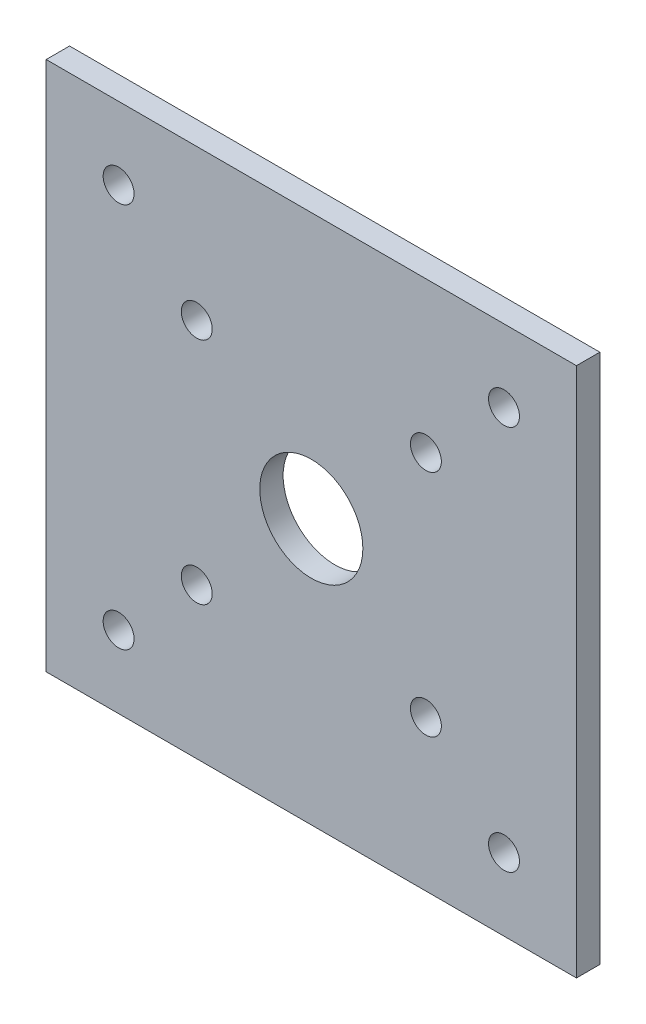
ISO-10303-21;
HEADER;
FILE_DESCRIPTION(('STEP AP214'),'2;1');
FILE_NAME('part.step','',(''),(''),'','','');
FILE_SCHEMA(('AUTOMOTIVE_DESIGN { 1 0 10303 214 1 1 1 1 }'));
ENDSEC;
DATA;
#1=APPLICATION_CONTEXT('core data for automotive mechanical design processes');
#2=APPLICATION_PROTOCOL_DEFINITION('international standard','automotive_design',2000,#1);
#3=PRODUCT_CONTEXT('',#1,'mechanical');
#4=PRODUCT('Part','Part','',(#3));
#5=PRODUCT_RELATED_PRODUCT_CATEGORY('part','',(#4));
#6=PRODUCT_DEFINITION_FORMATION('','',#4);
#7=PRODUCT_DEFINITION_CONTEXT('part definition',#1,'design');
#8=PRODUCT_DEFINITION('design','',#6,#7);
#9=PRODUCT_DEFINITION_SHAPE('','',#8);
#10=(LENGTH_UNIT() NAMED_UNIT(*) SI_UNIT(.MILLI.,.METRE.));
#11=(NAMED_UNIT(*) PLANE_ANGLE_UNIT() SI_UNIT($,.RADIAN.));
#12=(NAMED_UNIT(*) SI_UNIT($,.STERADIAN.) SOLID_ANGLE_UNIT());
#13=UNCERTAINTY_MEASURE_WITH_UNIT(LENGTH_MEASURE(1.E-05),#10,'distance_accuracy_value','');
#14=(GEOMETRIC_REPRESENTATION_CONTEXT(3) GLOBAL_UNCERTAINTY_ASSIGNED_CONTEXT((#13)) GLOBAL_UNIT_ASSIGNED_CONTEXT((#10,
#11,#12)) REPRESENTATION_CONTEXT('',''));
#15=CARTESIAN_POINT('',(0.,0.,0.));
#16=DIRECTION('',(0.,0.,1.));
#17=DIRECTION('',(1.,0.,0.));
#18=AXIS2_PLACEMENT_3D('',#15,#16,#17);
#19=CARTESIAN_POINT('',(0.,-36.,1.5875));
#20=DIRECTION('',(0.,1.,0.));
#21=DIRECTION('',(0.,0.,1.));
#22=AXIS2_PLACEMENT_3D('',#19,#20,#21);
#23=PLANE('',#22);
#24=DIRECTION('',(1.,0.,0.));
#25=VECTOR('',#24,1.);
#26=CARTESIAN_POINT('',(0.,-36.,-1.5875));
#27=LINE('',#26,#25);
#28=CARTESIAN_POINT('',(-36.,-36.,-1.5875));
#29=VERTEX_POINT('',#28);
#30=CARTESIAN_POINT('',(36.,-36.,-1.5875));
#31=VERTEX_POINT('',#30);
#32=EDGE_CURVE('E135',#29,#31,#27,.T.);
#33=ORIENTED_EDGE('',*,*,#32,.T.);
#34=DIRECTION('',(0.,0.,-1.));
#35=VECTOR('',#34,1.);
#36=CARTESIAN_POINT('',(36.,-36.,1.5875));
#37=LINE('',#36,#35);
#38=CARTESIAN_POINT('',(36.,-36.,1.5875));
#39=VERTEX_POINT('',#38);
#40=EDGE_CURVE('E11',#39,#31,#37,.T.);
#41=ORIENTED_EDGE('',*,*,#40,.F.);
#42=DIRECTION('',(1.,0.,0.));
#43=VECTOR('',#42,1.);
#44=CARTESIAN_POINT('',(0.,-36.,1.5875));
#45=LINE('',#44,#43);
#46=CARTESIAN_POINT('',(-36.,-36.,1.5875));
#47=VERTEX_POINT('',#46);
#48=EDGE_CURVE('E93',#47,#39,#45,.T.);
#49=ORIENTED_EDGE('',*,*,#48,.F.);
#50=DIRECTION('',(0.,0.,-1.));
#51=VECTOR('',#50,1.);
#52=CARTESIAN_POINT('',(-36.,-36.,1.5875));
#53=LINE('',#52,#51);
#54=EDGE_CURVE('E59',#47,#29,#53,.T.);
#55=ORIENTED_EDGE('',*,*,#54,.T.);
#56=EDGE_LOOP('',(#33,#41,#49,#55));
#57=FACE_BOUND('',#56,.T.);
#58=ADVANCED_FACE('F41',(#57),#23,.F.);
#59=CARTESIAN_POINT('',(36.,0.,1.5875));
#60=DIRECTION('',(-1.,0.,0.));
#61=DIRECTION('',(0.,0.,1.));
#62=AXIS2_PLACEMENT_3D('',#59,#60,#61);
#63=PLANE('',#62);
#64=DIRECTION('',(0.,1.,0.));
#65=VECTOR('',#64,1.);
#66=CARTESIAN_POINT('',(36.,0.,-1.5875));
#67=LINE('',#66,#65);
#68=CARTESIAN_POINT('',(36.,36.,-1.5875));
#69=VERTEX_POINT('',#68);
#70=EDGE_CURVE('E96',#31,#69,#67,.T.);
#71=ORIENTED_EDGE('',*,*,#70,.T.);
#72=DIRECTION('',(0.,0.,-1.));
#73=VECTOR('',#72,1.);
#74=CARTESIAN_POINT('',(36.,36.,1.5875));
#75=LINE('',#74,#73);
#76=CARTESIAN_POINT('',(36.,36.,1.5875));
#77=VERTEX_POINT('',#76);
#78=EDGE_CURVE('E49',#77,#69,#75,.T.);
#79=ORIENTED_EDGE('',*,*,#78,.F.);
#80=DIRECTION('',(0.,1.,0.));
#81=VECTOR('',#80,1.);
#82=CARTESIAN_POINT('',(36.,0.,1.5875));
#83=LINE('',#82,#81);
#84=EDGE_CURVE('E82',#39,#77,#83,.T.);
#85=ORIENTED_EDGE('',*,*,#84,.F.);
#86=ORIENTED_EDGE('',*,*,#40,.T.);
#87=EDGE_LOOP('',(#71,#79,#85,#86));
#88=FACE_BOUND('',#87,.T.);
#89=ADVANCED_FACE('F92',(#88),#63,.F.);
#90=CARTESIAN_POINT('',(0.,36.,1.5875));
#91=DIRECTION('',(0.,1.,0.));
#92=DIRECTION('',(0.,0.,1.));
#93=AXIS2_PLACEMENT_3D('',#90,#91,#92);
#94=PLANE('',#93);
#95=DIRECTION('',(1.,0.,0.));
#96=VECTOR('',#95,1.);
#97=CARTESIAN_POINT('',(0.,36.,-1.5875));
#98=LINE('',#97,#96);
#99=CARTESIAN_POINT('',(-36.,36.,-1.5875));
#100=VERTEX_POINT('',#99);
#101=EDGE_CURVE('E133',#100,#69,#98,.T.);
#102=ORIENTED_EDGE('',*,*,#101,.F.);
#103=DIRECTION('',(0.,0.,-1.));
#104=VECTOR('',#103,1.);
#105=CARTESIAN_POINT('',(-36.,36.,1.5875));
#106=LINE('',#105,#104);
#107=CARTESIAN_POINT('',(-36.,36.,1.5875));
#108=VERTEX_POINT('',#107);
#109=EDGE_CURVE('E75',#108,#100,#106,.T.);
#110=ORIENTED_EDGE('',*,*,#109,.F.);
#111=DIRECTION('',(1.,0.,0.));
#112=VECTOR('',#111,1.);
#113=CARTESIAN_POINT('',(0.,36.,1.5875));
#114=LINE('',#113,#112);
#115=EDGE_CURVE('E89',#108,#77,#114,.T.);
#116=ORIENTED_EDGE('',*,*,#115,.T.);
#117=ORIENTED_EDGE('',*,*,#78,.T.);
#118=EDGE_LOOP('',(#102,#110,#116,#117));
#119=FACE_BOUND('',#118,.T.);
#120=ADVANCED_FACE('F97',(#119),#94,.T.);
#121=CARTESIAN_POINT('',(-15.5563491861041,15.556349186104,1.5875));
#122=DIRECTION('',(0.,0.,-1.));
#123=DIRECTION('',(-1.,0.,0.));
#124=AXIS2_PLACEMENT_3D('',#121,#122,#123);
#125=CYLINDRICAL_SURFACE('',#124,2.10000000000001);
#126=CARTESIAN_POINT('',(-15.5563491861041,15.556349186104,1.5875));
#127=DIRECTION('',(0.,0.,1.));
#128=DIRECTION('',(1.,0.,0.));
#129=AXIS2_PLACEMENT_3D('',#126,#127,#128);
#130=CIRCLE('',#129,2.10000000000001);
#131=CARTESIAN_POINT('',(-13.4563491861041,15.556349186104,1.5875));
#132=VERTEX_POINT('',#131);
#133=EDGE_CURVE('E166',#132,#132,#130,.T.);
#134=ORIENTED_EDGE('',*,*,#133,.T.);
#135=EDGE_LOOP('',(#134));
#136=FACE_BOUND('',#135,.T.);
#137=CARTESIAN_POINT('',(-15.5563491861041,15.556349186104,-1.5875));
#138=DIRECTION('',(0.,0.,1.));
#139=DIRECTION('',(1.,0.,0.));
#140=AXIS2_PLACEMENT_3D('',#137,#138,#139);
#141=CIRCLE('',#140,2.10000000000001);
#142=CARTESIAN_POINT('',(-13.4563491861041,15.556349186104,-1.5875));
#143=VERTEX_POINT('',#142);
#144=EDGE_CURVE('E129',#143,#143,#141,.T.);
#145=ORIENTED_EDGE('',*,*,#144,.F.);
#146=EDGE_LOOP('',(#145));
#147=FACE_BOUND('',#146,.T.);
#148=ADVANCED_FACE('F174',(#136,#147),#125,.F.);
#149=CARTESIAN_POINT('',(15.556349186104,15.5563491861041,1.5875));
#150=DIRECTION('',(0.,0.,-1.));
#151=DIRECTION('',(-1.,0.,0.));
#152=AXIS2_PLACEMENT_3D('',#149,#150,#151);
#153=CYLINDRICAL_SURFACE('',#152,2.1);
#154=CARTESIAN_POINT('',(15.556349186104,15.5563491861041,1.5875));
#155=DIRECTION('',(0.,0.,1.));
#156=DIRECTION('',(1.,0.,0.));
#157=AXIS2_PLACEMENT_3D('',#154,#155,#156);
#158=CIRCLE('',#157,2.1);
#159=CARTESIAN_POINT('',(17.656349186104,15.5563491861041,1.5875));
#160=VERTEX_POINT('',#159);
#161=EDGE_CURVE('E167',#160,#160,#158,.T.);
#162=ORIENTED_EDGE('',*,*,#161,.T.);
#163=EDGE_LOOP('',(#162));
#164=FACE_BOUND('',#163,.T.);
#165=CARTESIAN_POINT('',(15.556349186104,15.5563491861041,-1.5875));
#166=DIRECTION('',(0.,0.,1.));
#167=DIRECTION('',(1.,0.,0.));
#168=AXIS2_PLACEMENT_3D('',#165,#166,#167);
#169=CIRCLE('',#168,2.1);
#170=CARTESIAN_POINT('',(17.656349186104,15.5563491861041,-1.5875));
#171=VERTEX_POINT('',#170);
#172=EDGE_CURVE('E127',#171,#171,#169,.T.);
#173=ORIENTED_EDGE('',*,*,#172,.F.);
#174=EDGE_LOOP('',(#173));
#175=FACE_BOUND('',#174,.T.);
#176=ADVANCED_FACE('F200',(#164,#175),#153,.F.);
#177=CARTESIAN_POINT('',(15.5563491861041,-15.556349186104,1.5875));
#178=DIRECTION('',(0.,0.,-1.));
#179=DIRECTION('',(-1.,0.,0.));
#180=AXIS2_PLACEMENT_3D('',#177,#178,#179);
#181=CYLINDRICAL_SURFACE('',#180,2.1);
#182=CARTESIAN_POINT('',(15.5563491861041,-15.556349186104,1.5875));
#183=DIRECTION('',(0.,0.,1.));
#184=DIRECTION('',(1.,0.,0.));
#185=AXIS2_PLACEMENT_3D('',#182,#183,#184);
#186=CIRCLE('',#185,2.1);
#187=CARTESIAN_POINT('',(17.6563491861041,-15.556349186104,1.5875));
#188=VERTEX_POINT('',#187);
#189=EDGE_CURVE('E162',#188,#188,#186,.T.);
#190=ORIENTED_EDGE('',*,*,#189,.T.);
#191=EDGE_LOOP('',(#190));
#192=FACE_BOUND('',#191,.T.);
#193=CARTESIAN_POINT('',(15.5563491861041,-15.556349186104,-1.5875));
#194=DIRECTION('',(0.,0.,1.));
#195=DIRECTION('',(1.,0.,0.));
#196=AXIS2_PLACEMENT_3D('',#193,#194,#195);
#197=CIRCLE('',#196,2.1);
#198=CARTESIAN_POINT('',(17.6563491861041,-15.556349186104,-1.5875));
#199=VERTEX_POINT('',#198);
#200=EDGE_CURVE('E122',#199,#199,#197,.T.);
#201=ORIENTED_EDGE('',*,*,#200,.F.);
#202=EDGE_LOOP('',(#201));
#203=FACE_BOUND('',#202,.T.);
#204=ADVANCED_FACE('F205',(#192,#203),#181,.F.);
#205=CARTESIAN_POINT('',(-15.556349186104,-15.5563491861041,1.5875));
#206=DIRECTION('',(0.,0.,-1.));
#207=DIRECTION('',(-1.,0.,0.));
#208=AXIS2_PLACEMENT_3D('',#205,#206,#207);
#209=CYLINDRICAL_SURFACE('',#208,2.1);
#210=CARTESIAN_POINT('',(-15.556349186104,-15.5563491861041,1.5875));
#211=DIRECTION('',(0.,0.,1.));
#212=DIRECTION('',(1.,0.,0.));
#213=AXIS2_PLACEMENT_3D('',#210,#211,#212);
#214=CIRCLE('',#213,2.1);
#215=CARTESIAN_POINT('',(-13.456349186104,-15.5563491861041,1.5875));
#216=VERTEX_POINT('',#215);
#217=EDGE_CURVE('E159',#216,#216,#214,.T.);
#218=ORIENTED_EDGE('',*,*,#217,.T.);
#219=EDGE_LOOP('',(#218));
#220=FACE_BOUND('',#219,.T.);
#221=CARTESIAN_POINT('',(-15.556349186104,-15.5563491861041,-1.5875));
#222=DIRECTION('',(0.,0.,1.));
#223=DIRECTION('',(1.,0.,0.));
#224=AXIS2_PLACEMENT_3D('',#221,#222,#223);
#225=CIRCLE('',#224,2.1);
#226=CARTESIAN_POINT('',(-13.456349186104,-15.5563491861041,-1.5875));
#227=VERTEX_POINT('',#226);
#228=EDGE_CURVE('E118',#227,#227,#225,.T.);
#229=ORIENTED_EDGE('',*,*,#228,.F.);
#230=EDGE_LOOP('',(#229));
#231=FACE_BOUND('',#230,.T.);
#232=ADVANCED_FACE('F206',(#220,#231),#209,.F.);
#233=CARTESIAN_POINT('',(26.1629509039023,26.1629509039023,1.5875));
#234=DIRECTION('',(0.,0.,-1.));
#235=DIRECTION('',(-1.,0.,0.));
#236=AXIS2_PLACEMENT_3D('',#233,#234,#235);
#237=CYLINDRICAL_SURFACE('',#236,2.1);
#238=CARTESIAN_POINT('',(26.1629509039023,26.1629509039023,1.5875));
#239=DIRECTION('',(0.,0.,1.));
#240=DIRECTION('',(1.,0.,0.));
#241=AXIS2_PLACEMENT_3D('',#238,#239,#240);
#242=CIRCLE('',#241,2.1);
#243=CARTESIAN_POINT('',(28.2629509039023,26.1629509039023,1.5875));
#244=VERTEX_POINT('',#243);
#245=EDGE_CURVE('E160',#244,#244,#242,.T.);
#246=ORIENTED_EDGE('',*,*,#245,.T.);
#247=EDGE_LOOP('',(#246));
#248=FACE_BOUND('',#247,.T.);
#249=CARTESIAN_POINT('',(26.1629509039023,26.1629509039023,-1.5875));
#250=DIRECTION('',(0.,0.,1.));
#251=DIRECTION('',(1.,0.,0.));
#252=AXIS2_PLACEMENT_3D('',#249,#250,#251);
#253=CIRCLE('',#252,2.1);
#254=CARTESIAN_POINT('',(28.2629509039023,26.1629509039023,-1.5875));
#255=VERTEX_POINT('',#254);
#256=EDGE_CURVE('E120',#255,#255,#253,.T.);
#257=ORIENTED_EDGE('',*,*,#256,.F.);
#258=EDGE_LOOP('',(#257));
#259=FACE_BOUND('',#258,.T.);
#260=ADVANCED_FACE('F209',(#248,#259),#237,.F.);
#261=CARTESIAN_POINT('',(26.1629509039023,-26.1629509039023,1.5875));
#262=DIRECTION('',(0.,0.,-1.));
#263=DIRECTION('',(-1.,0.,0.));
#264=AXIS2_PLACEMENT_3D('',#261,#262,#263);
#265=CYLINDRICAL_SURFACE('',#264,2.1);
#266=CARTESIAN_POINT('',(26.1629509039023,-26.1629509039023,1.5875));
#267=DIRECTION('',(0.,0.,1.));
#268=DIRECTION('',(1.,0.,0.));
#269=AXIS2_PLACEMENT_3D('',#266,#267,#268);
#270=CIRCLE('',#269,2.1);
#271=CARTESIAN_POINT('',(28.2629509039023,-26.1629509039023,1.5875));
#272=VERTEX_POINT('',#271);
#273=EDGE_CURVE('E152',#272,#272,#270,.T.);
#274=ORIENTED_EDGE('',*,*,#273,.T.);
#275=EDGE_LOOP('',(#274));
#276=FACE_BOUND('',#275,.T.);
#277=CARTESIAN_POINT('',(26.1629509039023,-26.1629509039023,-1.5875));
#278=DIRECTION('',(0.,0.,1.));
#279=DIRECTION('',(1.,0.,0.));
#280=AXIS2_PLACEMENT_3D('',#277,#278,#279);
#281=CIRCLE('',#280,2.1);
#282=CARTESIAN_POINT('',(28.2629509039023,-26.1629509039023,-1.5875));
#283=VERTEX_POINT('',#282);
#284=EDGE_CURVE('E111',#283,#283,#281,.T.);
#285=ORIENTED_EDGE('',*,*,#284,.F.);
#286=EDGE_LOOP('',(#285));
#287=FACE_BOUND('',#286,.T.);
#288=ADVANCED_FACE('F212',(#276,#287),#265,.F.);
#289=CARTESIAN_POINT('',(-26.1629509039023,-26.1629509039023,1.5875));
#290=DIRECTION('',(0.,0.,-1.));
#291=DIRECTION('',(-1.,0.,0.));
#292=AXIS2_PLACEMENT_3D('',#289,#290,#291);
#293=CYLINDRICAL_SURFACE('',#292,2.1);
#294=CARTESIAN_POINT('',(-26.1629509039023,-26.1629509039023,1.5875));
#295=DIRECTION('',(0.,0.,1.));
#296=DIRECTION('',(1.,0.,0.));
#297=AXIS2_PLACEMENT_3D('',#294,#295,#296);
#298=CIRCLE('',#297,2.1);
#299=CARTESIAN_POINT('',(-24.0629509039023,-26.1629509039023,1.5875));
#300=VERTEX_POINT('',#299);
#301=EDGE_CURVE('E149',#300,#300,#298,.T.);
#302=ORIENTED_EDGE('',*,*,#301,.T.);
#303=EDGE_LOOP('',(#302));
#304=FACE_BOUND('',#303,.T.);
#305=CARTESIAN_POINT('',(-26.1629509039023,-26.1629509039023,-1.5875));
#306=DIRECTION('',(0.,0.,1.));
#307=DIRECTION('',(1.,0.,0.));
#308=AXIS2_PLACEMENT_3D('',#305,#306,#307);
#309=CIRCLE('',#308,2.1);
#310=CARTESIAN_POINT('',(-24.0629509039023,-26.1629509039023,-1.5875));
#311=VERTEX_POINT('',#310);
#312=EDGE_CURVE('E112',#311,#311,#309,.T.);
#313=ORIENTED_EDGE('',*,*,#312,.F.);
#314=EDGE_LOOP('',(#313));
#315=FACE_BOUND('',#314,.T.);
#316=ADVANCED_FACE('F217',(#304,#315),#293,.F.);
#317=CARTESIAN_POINT('',(-26.1629509039023,26.1629509039023,1.5875));
#318=DIRECTION('',(0.,0.,-1.));
#319=DIRECTION('',(-1.,0.,0.));
#320=AXIS2_PLACEMENT_3D('',#317,#318,#319);
#321=CYLINDRICAL_SURFACE('',#320,2.1);
#322=CARTESIAN_POINT('',(-26.1629509039023,26.1629509039023,1.5875));
#323=DIRECTION('',(0.,0.,1.));
#324=DIRECTION('',(1.,0.,0.));
#325=AXIS2_PLACEMENT_3D('',#322,#323,#324);
#326=CIRCLE('',#325,2.1);
#327=CARTESIAN_POINT('',(-24.0629509039023,26.1629509039023,1.5875));
#328=VERTEX_POINT('',#327);
#329=EDGE_CURVE('E145',#328,#328,#326,.T.);
#330=ORIENTED_EDGE('',*,*,#329,.T.);
#331=EDGE_LOOP('',(#330));
#332=FACE_BOUND('',#331,.T.);
#333=CARTESIAN_POINT('',(-26.1629509039023,26.1629509039023,-1.5875));
#334=DIRECTION('',(0.,0.,1.));
#335=DIRECTION('',(1.,0.,0.));
#336=AXIS2_PLACEMENT_3D('',#333,#334,#335);
#337=CIRCLE('',#336,2.1);
#338=CARTESIAN_POINT('',(-24.0629509039023,26.1629509039023,-1.5875));
#339=VERTEX_POINT('',#338);
#340=EDGE_CURVE('E107',#339,#339,#337,.T.);
#341=ORIENTED_EDGE('',*,*,#340,.F.);
#342=EDGE_LOOP('',(#341));
#343=FACE_BOUND('',#342,.T.);
#344=ADVANCED_FACE('F222',(#332,#343),#321,.F.);
#345=CARTESIAN_POINT('',(0.,0.,1.5875));
#346=DIRECTION('',(0.,0.,-1.));
#347=DIRECTION('',(-1.,0.,0.));
#348=AXIS2_PLACEMENT_3D('',#345,#346,#347);
#349=CYLINDRICAL_SURFACE('',#348,7.);
#350=CARTESIAN_POINT('',(0.,0.,1.5875));
#351=DIRECTION('',(0.,0.,1.));
#352=DIRECTION('',(1.,0.,0.));
#353=AXIS2_PLACEMENT_3D('',#350,#351,#352);
#354=CIRCLE('',#353,7.);
#355=CARTESIAN_POINT('',(7.00000000000001,0.,1.5875));
#356=VERTEX_POINT('',#355);
#357=EDGE_CURVE('E136',#356,#356,#354,.T.);
#358=ORIENTED_EDGE('',*,*,#357,.T.);
#359=EDGE_LOOP('',(#358));
#360=FACE_BOUND('',#359,.T.);
#361=CARTESIAN_POINT('',(0.,0.,-1.5875));
#362=DIRECTION('',(0.,0.,1.));
#363=DIRECTION('',(1.,0.,0.));
#364=AXIS2_PLACEMENT_3D('',#361,#362,#363);
#365=CIRCLE('',#364,7.);
#366=CARTESIAN_POINT('',(7.00000000000001,0.,-1.5875));
#367=VERTEX_POINT('',#366);
#368=EDGE_CURVE('E104',#367,#367,#365,.T.);
#369=ORIENTED_EDGE('',*,*,#368,.F.);
#370=EDGE_LOOP('',(#369));
#371=FACE_BOUND('',#370,.T.);
#372=ADVANCED_FACE('F43',(#360,#371),#349,.F.);
#373=CARTESIAN_POINT('',(-36.,0.,1.5875));
#374=DIRECTION('',(-1.,0.,0.));
#375=DIRECTION('',(0.,0.,1.));
#376=AXIS2_PLACEMENT_3D('',#373,#374,#375);
#377=PLANE('',#376);
#378=DIRECTION('',(0.,1.,0.));
#379=VECTOR('',#378,1.);
#380=CARTESIAN_POINT('',(-36.,0.,-1.5875));
#381=LINE('',#380,#379);
#382=EDGE_CURVE('E139',#29,#100,#381,.T.);
#383=ORIENTED_EDGE('',*,*,#382,.F.);
#384=ORIENTED_EDGE('',*,*,#54,.F.);
#385=DIRECTION('',(0.,1.,0.));
#386=VECTOR('',#385,1.);
#387=CARTESIAN_POINT('',(-36.,0.,1.5875));
#388=LINE('',#387,#386);
#389=EDGE_CURVE('E99',#47,#108,#388,.T.);
#390=ORIENTED_EDGE('',*,*,#389,.T.);
#391=ORIENTED_EDGE('',*,*,#109,.T.);
#392=EDGE_LOOP('',(#383,#384,#390,#391));
#393=FACE_BOUND('',#392,.T.);
#394=ADVANCED_FACE('F177',(#393),#377,.T.);
#395=CARTESIAN_POINT('',(0.,0.,1.5875));
#396=DIRECTION('',(0.,0.,1.));
#397=DIRECTION('',(1.,0.,0.));
#398=AXIS2_PLACEMENT_3D('',#395,#396,#397);
#399=PLANE('',#398);
#400=ORIENTED_EDGE('',*,*,#357,.F.);
#401=EDGE_LOOP('',(#400));
#402=FACE_BOUND('',#401,.T.);
#403=ORIENTED_EDGE('',*,*,#329,.F.);
#404=EDGE_LOOP('',(#403));
#405=FACE_BOUND('',#404,.T.);
#406=ORIENTED_EDGE('',*,*,#301,.F.);
#407=EDGE_LOOP('',(#406));
#408=FACE_BOUND('',#407,.T.);
#409=ORIENTED_EDGE('',*,*,#273,.F.);
#410=EDGE_LOOP('',(#409));
#411=FACE_BOUND('',#410,.T.);
#412=ORIENTED_EDGE('',*,*,#245,.F.);
#413=EDGE_LOOP('',(#412));
#414=FACE_BOUND('',#413,.T.);
#415=ORIENTED_EDGE('',*,*,#217,.F.);
#416=EDGE_LOOP('',(#415));
#417=FACE_BOUND('',#416,.T.);
#418=ORIENTED_EDGE('',*,*,#189,.F.);
#419=EDGE_LOOP('',(#418));
#420=FACE_BOUND('',#419,.T.);
#421=ORIENTED_EDGE('',*,*,#161,.F.);
#422=EDGE_LOOP('',(#421));
#423=FACE_BOUND('',#422,.T.);
#424=ORIENTED_EDGE('',*,*,#133,.F.);
#425=EDGE_LOOP('',(#424));
#426=FACE_BOUND('',#425,.T.);
#427=ORIENTED_EDGE('',*,*,#48,.T.);
#428=ORIENTED_EDGE('',*,*,#84,.T.);
#429=ORIENTED_EDGE('',*,*,#115,.F.);
#430=ORIENTED_EDGE('',*,*,#389,.F.);
#431=EDGE_LOOP('',(#427,#428,#429,#430));
#432=FACE_BOUND('',#431,.T.);
#433=ADVANCED_FACE('F87',(#402,#405,#408,#411,#414,#417,#420,#423,#426,#432),#399,.T.);
#434=CARTESIAN_POINT('',(0.,0.,-1.5875));
#435=DIRECTION('',(0.,0.,1.));
#436=DIRECTION('',(1.,0.,0.));
#437=AXIS2_PLACEMENT_3D('',#434,#435,#436);
#438=PLANE('',#437);
#439=ORIENTED_EDGE('',*,*,#368,.T.);
#440=EDGE_LOOP('',(#439));
#441=FACE_BOUND('',#440,.T.);
#442=ORIENTED_EDGE('',*,*,#340,.T.);
#443=EDGE_LOOP('',(#442));
#444=FACE_BOUND('',#443,.T.);
#445=ORIENTED_EDGE('',*,*,#312,.T.);
#446=EDGE_LOOP('',(#445));
#447=FACE_BOUND('',#446,.T.);
#448=ORIENTED_EDGE('',*,*,#284,.T.);
#449=EDGE_LOOP('',(#448));
#450=FACE_BOUND('',#449,.T.);
#451=ORIENTED_EDGE('',*,*,#256,.T.);
#452=EDGE_LOOP('',(#451));
#453=FACE_BOUND('',#452,.T.);
#454=ORIENTED_EDGE('',*,*,#228,.T.);
#455=EDGE_LOOP('',(#454));
#456=FACE_BOUND('',#455,.T.);
#457=ORIENTED_EDGE('',*,*,#200,.T.);
#458=EDGE_LOOP('',(#457));
#459=FACE_BOUND('',#458,.T.);
#460=ORIENTED_EDGE('',*,*,#172,.T.);
#461=EDGE_LOOP('',(#460));
#462=FACE_BOUND('',#461,.T.);
#463=ORIENTED_EDGE('',*,*,#144,.T.);
#464=EDGE_LOOP('',(#463));
#465=FACE_BOUND('',#464,.T.);
#466=ORIENTED_EDGE('',*,*,#32,.F.);
#467=ORIENTED_EDGE('',*,*,#382,.T.);
#468=ORIENTED_EDGE('',*,*,#101,.T.);
#469=ORIENTED_EDGE('',*,*,#70,.F.);
#470=EDGE_LOOP('',(#466,#467,#468,#469));
#471=FACE_BOUND('',#470,.T.);
#472=ADVANCED_FACE('F179',(#441,#444,#447,#450,#453,#456,#459,#462,#465,#471),#438,.F.);
#473=CLOSED_SHELL('',(#58,#89,#120,#148,#176,#204,#232,#260,#288,#316,#344,#372,#394,#433,#472));
#474=MANIFOLD_SOLID_BREP('B2',#473);
#475=ADVANCED_BREP_SHAPE_REPRESENTATION('',(#18,#474),#14);
#476=SHAPE_DEFINITION_REPRESENTATION(#9,#475);
ENDSEC;
END-ISO-10303-21;
